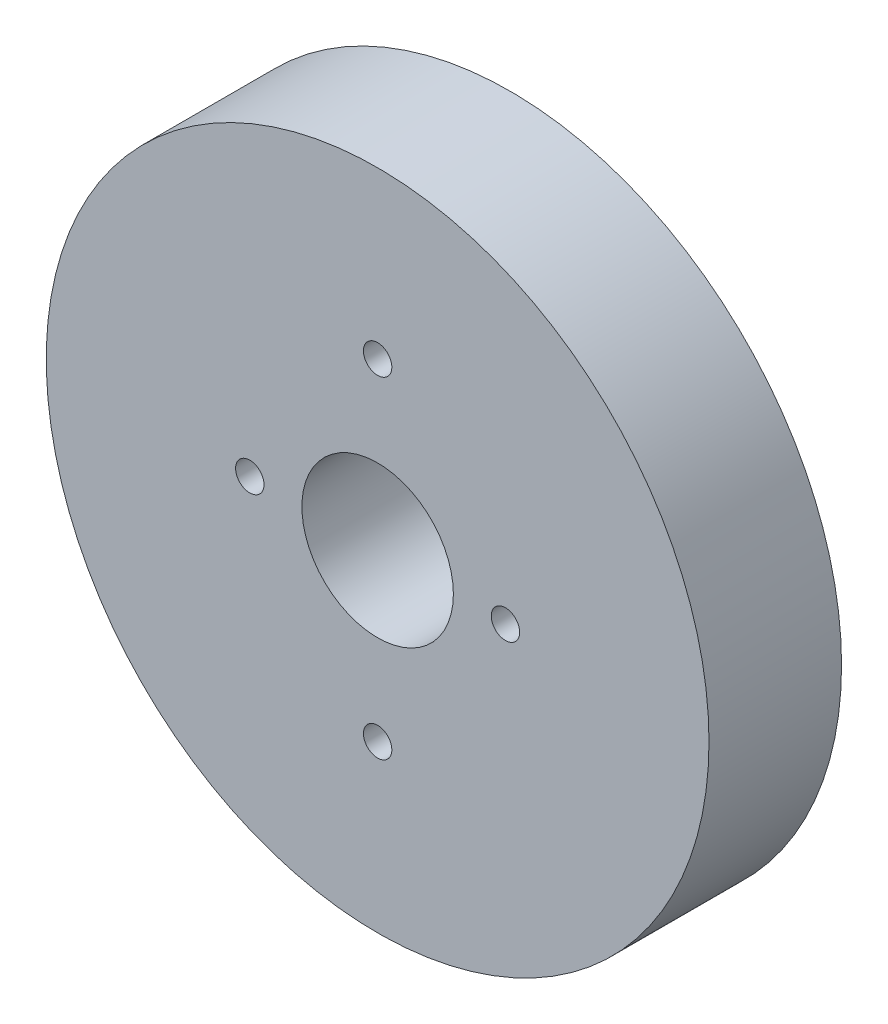
ISO-10303-21;
HEADER;
FILE_DESCRIPTION(('STEP AP214'),'2;1');
FILE_NAME('part.step','',(''),(''),'','','');
FILE_SCHEMA(('AUTOMOTIVE_DESIGN { 1 0 10303 214 1 1 1 1 }'));
ENDSEC;
DATA;
#1=APPLICATION_CONTEXT('core data for automotive mechanical design processes');
#2=APPLICATION_PROTOCOL_DEFINITION('international standard','automotive_design',2000,#1);
#3=PRODUCT_CONTEXT('',#1,'mechanical');
#4=PRODUCT('Part','Part','',(#3));
#5=PRODUCT_RELATED_PRODUCT_CATEGORY('part','',(#4));
#6=PRODUCT_DEFINITION_FORMATION('','',#4);
#7=PRODUCT_DEFINITION_CONTEXT('part definition',#1,'design');
#8=PRODUCT_DEFINITION('design','',#6,#7);
#9=PRODUCT_DEFINITION_SHAPE('','',#8);
#10=(LENGTH_UNIT() NAMED_UNIT(*) SI_UNIT(.MILLI.,.METRE.));
#11=(NAMED_UNIT(*) PLANE_ANGLE_UNIT() SI_UNIT($,.RADIAN.));
#12=(NAMED_UNIT(*) SI_UNIT($,.STERADIAN.) SOLID_ANGLE_UNIT());
#13=UNCERTAINTY_MEASURE_WITH_UNIT(LENGTH_MEASURE(1.E-05),#10,'distance_accuracy_value','');
#14=(GEOMETRIC_REPRESENTATION_CONTEXT(3) GLOBAL_UNCERTAINTY_ASSIGNED_CONTEXT((#13)) GLOBAL_UNIT_ASSIGNED_CONTEXT((#10,
#11,#12)) REPRESENTATION_CONTEXT('',''));
#15=CARTESIAN_POINT('',(0.,0.,0.));
#16=DIRECTION('',(0.,0.,1.));
#17=DIRECTION('',(1.,0.,0.));
#18=AXIS2_PLACEMENT_3D('',#15,#16,#17);
#19=CARTESIAN_POINT('',(0.,0.,7.));
#20=DIRECTION('',(0.,0.,1.));
#21=DIRECTION('',(1.,0.,0.));
#22=AXIS2_PLACEMENT_3D('',#19,#20,#21);
#23=PLANE('',#22);
#24=CARTESIAN_POINT('',(-6.75,0.,7.));
#25=DIRECTION('',(0.,0.,1.));
#26=DIRECTION('',(-1.,0.,0.));
#27=AXIS2_PLACEMENT_3D('',#24,#25,#26);
#28=CIRCLE('',#27,0.749999999999999);
#29=CARTESIAN_POINT('',(-7.5,0.,7.));
#30=VERTEX_POINT('',#29);
#31=EDGE_CURVE('E59',#30,#30,#28,.T.);
#32=ORIENTED_EDGE('',*,*,#31,.F.);
#33=EDGE_LOOP('',(#32));
#34=FACE_BOUND('',#33,.T.);
#35=CARTESIAN_POINT('',(6.75,0.,7.));
#36=DIRECTION('',(0.,0.,1.));
#37=DIRECTION('',(1.,0.,0.));
#38=AXIS2_PLACEMENT_3D('',#35,#36,#37);
#39=CIRCLE('',#38,0.749999999999999);
#40=CARTESIAN_POINT('',(7.5,0.,7.));
#41=VERTEX_POINT('',#40);
#42=EDGE_CURVE('E47',#41,#41,#39,.T.);
#43=ORIENTED_EDGE('',*,*,#42,.F.);
#44=EDGE_LOOP('',(#43));
#45=FACE_BOUND('',#44,.T.);
#46=CARTESIAN_POINT('',(0.,0.,7.));
#47=DIRECTION('',(0.,0.,1.));
#48=DIRECTION('',(1.,0.,0.));
#49=AXIS2_PLACEMENT_3D('',#46,#47,#48);
#50=CIRCLE('',#49,17.5);
#51=CARTESIAN_POINT('',(17.5,0.,7.));
#52=VERTEX_POINT('',#51);
#53=EDGE_CURVE('E10',#52,#52,#50,.T.);
#54=ORIENTED_EDGE('',*,*,#53,.T.);
#55=EDGE_LOOP('',(#54));
#56=FACE_BOUND('',#55,.T.);
#57=CARTESIAN_POINT('',(0.,0.,7.));
#58=DIRECTION('',(0.,0.,1.));
#59=DIRECTION('',(1.,0.,0.));
#60=AXIS2_PLACEMENT_3D('',#57,#58,#59);
#61=CIRCLE('',#60,4.);
#62=CARTESIAN_POINT('',(4.,0.,7.));
#63=VERTEX_POINT('',#62);
#64=EDGE_CURVE('E42',#63,#63,#61,.T.);
#65=ORIENTED_EDGE('',*,*,#64,.F.);
#66=EDGE_LOOP('',(#65));
#67=FACE_BOUND('',#66,.T.);
#68=CARTESIAN_POINT('',(0.,8.75,7.));
#69=DIRECTION('',(0.,0.,1.));
#70=DIRECTION('',(1.,0.,0.));
#71=AXIS2_PLACEMENT_3D('',#68,#69,#70);
#72=CIRCLE('',#71,0.75);
#73=CARTESIAN_POINT('',(0.75,8.75,7.));
#74=VERTEX_POINT('',#73);
#75=EDGE_CURVE('E53',#74,#74,#72,.T.);
#76=ORIENTED_EDGE('',*,*,#75,.F.);
#77=EDGE_LOOP('',(#76));
#78=FACE_BOUND('',#77,.T.);
#79=CARTESIAN_POINT('',(0.,-8.75,7.));
#80=DIRECTION('',(0.,0.,1.));
#81=DIRECTION('',(-1.,0.,0.));
#82=AXIS2_PLACEMENT_3D('',#79,#80,#81);
#83=CIRCLE('',#82,0.75);
#84=CARTESIAN_POINT('',(-0.75,-8.75,7.));
#85=VERTEX_POINT('',#84);
#86=EDGE_CURVE('E65',#85,#85,#83,.T.);
#87=ORIENTED_EDGE('',*,*,#86,.F.);
#88=EDGE_LOOP('',(#87));
#89=FACE_BOUND('',#88,.T.);
#90=ADVANCED_FACE('F31',(#34,#45,#56,#67,#78,#89),#23,.T.);
#91=CARTESIAN_POINT('',(0.,0.,0.));
#92=DIRECTION('',(0.,0.,1.));
#93=DIRECTION('',(1.,0.,0.));
#94=AXIS2_PLACEMENT_3D('',#91,#92,#93);
#95=PLANE('',#94);
#96=CARTESIAN_POINT('',(0.,0.,0.));
#97=DIRECTION('',(0.,0.,1.));
#98=DIRECTION('',(1.,0.,0.));
#99=AXIS2_PLACEMENT_3D('',#96,#97,#98);
#100=CIRCLE('',#99,17.5);
#101=CARTESIAN_POINT('',(17.5,0.,0.));
#102=VERTEX_POINT('',#101);
#103=EDGE_CURVE('E35',#102,#102,#100,.T.);
#104=ORIENTED_EDGE('',*,*,#103,.F.);
#105=EDGE_LOOP('',(#104));
#106=FACE_BOUND('',#105,.T.);
#107=CARTESIAN_POINT('',(0.,0.,0.));
#108=DIRECTION('',(0.,0.,1.));
#109=DIRECTION('',(1.,0.,0.));
#110=AXIS2_PLACEMENT_3D('',#107,#108,#109);
#111=CIRCLE('',#110,4.);
#112=CARTESIAN_POINT('',(4.,0.,0.));
#113=VERTEX_POINT('',#112);
#114=EDGE_CURVE('E44',#113,#113,#111,.T.);
#115=ORIENTED_EDGE('',*,*,#114,.T.);
#116=EDGE_LOOP('',(#115));
#117=FACE_BOUND('',#116,.T.);
#118=CARTESIAN_POINT('',(6.75,0.,0.));
#119=DIRECTION('',(0.,0.,1.));
#120=DIRECTION('',(1.,0.,0.));
#121=AXIS2_PLACEMENT_3D('',#118,#119,#120);
#122=CIRCLE('',#121,0.749999999999999);
#123=CARTESIAN_POINT('',(7.5,0.,0.));
#124=VERTEX_POINT('',#123);
#125=EDGE_CURVE('E50',#124,#124,#122,.T.);
#126=ORIENTED_EDGE('',*,*,#125,.T.);
#127=EDGE_LOOP('',(#126));
#128=FACE_BOUND('',#127,.T.);
#129=CARTESIAN_POINT('',(0.,8.75,0.));
#130=DIRECTION('',(0.,0.,1.));
#131=DIRECTION('',(1.,0.,0.));
#132=AXIS2_PLACEMENT_3D('',#129,#130,#131);
#133=CIRCLE('',#132,0.75);
#134=CARTESIAN_POINT('',(0.75,8.75,0.));
#135=VERTEX_POINT('',#134);
#136=EDGE_CURVE('E56',#135,#135,#133,.T.);
#137=ORIENTED_EDGE('',*,*,#136,.T.);
#138=EDGE_LOOP('',(#137));
#139=FACE_BOUND('',#138,.T.);
#140=CARTESIAN_POINT('',(-6.75,0.,0.));
#141=DIRECTION('',(0.,0.,1.));
#142=DIRECTION('',(-1.,0.,0.));
#143=AXIS2_PLACEMENT_3D('',#140,#141,#142);
#144=CIRCLE('',#143,0.749999999999999);
#145=CARTESIAN_POINT('',(-7.5,0.,0.));
#146=VERTEX_POINT('',#145);
#147=EDGE_CURVE('E62',#146,#146,#144,.T.);
#148=ORIENTED_EDGE('',*,*,#147,.T.);
#149=EDGE_LOOP('',(#148));
#150=FACE_BOUND('',#149,.T.);
#151=CARTESIAN_POINT('',(0.,-8.75,0.));
#152=DIRECTION('',(0.,0.,1.));
#153=DIRECTION('',(-1.,0.,0.));
#154=AXIS2_PLACEMENT_3D('',#151,#152,#153);
#155=CIRCLE('',#154,0.75);
#156=CARTESIAN_POINT('',(-0.75,-8.75,0.));
#157=VERTEX_POINT('',#156);
#158=EDGE_CURVE('E68',#157,#157,#155,.T.);
#159=ORIENTED_EDGE('',*,*,#158,.T.);
#160=EDGE_LOOP('',(#159));
#161=FACE_BOUND('',#160,.T.);
#162=ADVANCED_FACE('F78',(#106,#117,#128,#139,#150,#161),#95,.F.);
#163=CARTESIAN_POINT('',(0.,0.,7.));
#164=DIRECTION('',(0.,0.,-1.));
#165=DIRECTION('',(-1.,0.,0.));
#166=AXIS2_PLACEMENT_3D('',#163,#164,#165);
#167=CYLINDRICAL_SURFACE('',#166,17.5);
#168=ORIENTED_EDGE('',*,*,#53,.F.);
#169=EDGE_LOOP('',(#168));
#170=FACE_BOUND('',#169,.T.);
#171=ORIENTED_EDGE('',*,*,#103,.T.);
#172=EDGE_LOOP('',(#171));
#173=FACE_BOUND('',#172,.T.);
#174=ADVANCED_FACE('F33',(#170,#173),#167,.T.);
#175=CARTESIAN_POINT('',(0.,0.,7.));
#176=DIRECTION('',(0.,0.,-1.));
#177=DIRECTION('',(-1.,0.,0.));
#178=AXIS2_PLACEMENT_3D('',#175,#176,#177);
#179=CYLINDRICAL_SURFACE('',#178,4.);
#180=ORIENTED_EDGE('',*,*,#64,.T.);
#181=EDGE_LOOP('',(#180));
#182=FACE_BOUND('',#181,.T.);
#183=ORIENTED_EDGE('',*,*,#114,.F.);
#184=EDGE_LOOP('',(#183));
#185=FACE_BOUND('',#184,.T.);
#186=ADVANCED_FACE('F88',(#182,#185),#179,.F.);
#187=CARTESIAN_POINT('',(6.75,0.,7.));
#188=DIRECTION('',(0.,0.,-1.));
#189=DIRECTION('',(-1.,0.,0.));
#190=AXIS2_PLACEMENT_3D('',#187,#188,#189);
#191=CYLINDRICAL_SURFACE('',#190,0.749999999999999);
#192=ORIENTED_EDGE('',*,*,#42,.T.);
#193=EDGE_LOOP('',(#192));
#194=FACE_BOUND('',#193,.T.);
#195=ORIENTED_EDGE('',*,*,#125,.F.);
#196=EDGE_LOOP('',(#195));
#197=FACE_BOUND('',#196,.T.);
#198=ADVANCED_FACE('F91',(#194,#197),#191,.F.);
#199=CARTESIAN_POINT('',(0.,8.75,7.));
#200=DIRECTION('',(0.,0.,-1.));
#201=DIRECTION('',(-1.,0.,0.));
#202=AXIS2_PLACEMENT_3D('',#199,#200,#201);
#203=CYLINDRICAL_SURFACE('',#202,0.75);
#204=ORIENTED_EDGE('',*,*,#75,.T.);
#205=EDGE_LOOP('',(#204));
#206=FACE_BOUND('',#205,.T.);
#207=ORIENTED_EDGE('',*,*,#136,.F.);
#208=EDGE_LOOP('',(#207));
#209=FACE_BOUND('',#208,.T.);
#210=ADVANCED_FACE('F95',(#206,#209),#203,.F.);
#211=CARTESIAN_POINT('',(-6.75,0.,7.));
#212=DIRECTION('',(0.,0.,-1.));
#213=DIRECTION('',(-1.,0.,0.));
#214=AXIS2_PLACEMENT_3D('',#211,#212,#213);
#215=CYLINDRICAL_SURFACE('',#214,0.749999999999999);
#216=ORIENTED_EDGE('',*,*,#31,.T.);
#217=EDGE_LOOP('',(#216));
#218=FACE_BOUND('',#217,.T.);
#219=ORIENTED_EDGE('',*,*,#147,.F.);
#220=EDGE_LOOP('',(#219));
#221=FACE_BOUND('',#220,.T.);
#222=ADVANCED_FACE('F99',(#218,#221),#215,.F.);
#223=CARTESIAN_POINT('',(0.,-8.75,7.));
#224=DIRECTION('',(0.,0.,-1.));
#225=DIRECTION('',(-1.,0.,0.));
#226=AXIS2_PLACEMENT_3D('',#223,#224,#225);
#227=CYLINDRICAL_SURFACE('',#226,0.75);
#228=ORIENTED_EDGE('',*,*,#86,.T.);
#229=EDGE_LOOP('',(#228));
#230=FACE_BOUND('',#229,.T.);
#231=ORIENTED_EDGE('',*,*,#158,.F.);
#232=EDGE_LOOP('',(#231));
#233=FACE_BOUND('',#232,.T.);
#234=ADVANCED_FACE('F74',(#230,#233),#227,.F.);
#235=CLOSED_SHELL('',(#90,#162,#174,#186,#198,#210,#222,#234));
#236=MANIFOLD_SOLID_BREP('B2',#235);
#237=ADVANCED_BREP_SHAPE_REPRESENTATION('',(#18,#236),#14);
#238=SHAPE_DEFINITION_REPRESENTATION(#9,#237);
ENDSEC;
END-ISO-10303-21;
